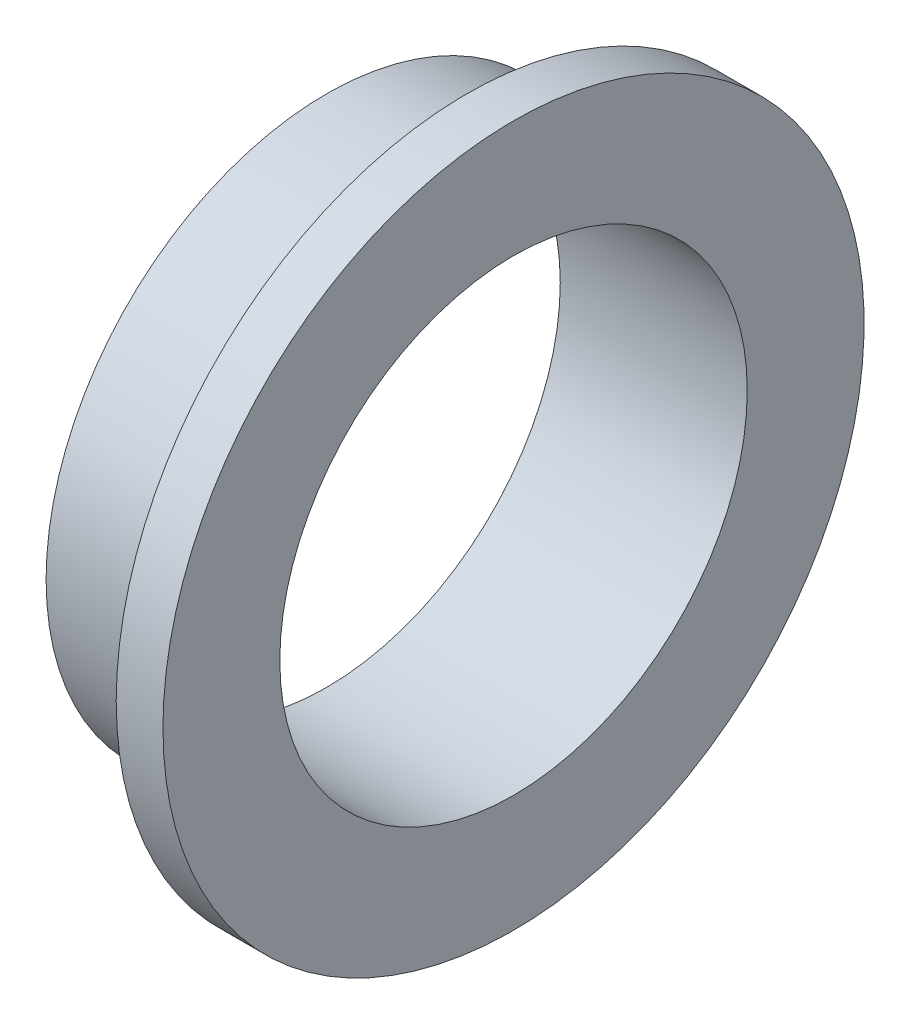
ISO-10303-21;
HEADER;
FILE_DESCRIPTION(('STEP AP214'),'2;1');
FILE_NAME('part.step','',(''),(''),'','','');
FILE_SCHEMA(('AUTOMOTIVE_DESIGN { 1 0 10303 214 1 1 1 1 }'));
ENDSEC;
DATA;
#1=APPLICATION_CONTEXT('core data for automotive mechanical design processes');
#2=APPLICATION_PROTOCOL_DEFINITION('international standard','automotive_design',2000,#1);
#3=PRODUCT_CONTEXT('',#1,'mechanical');
#4=PRODUCT('Part','Part','',(#3));
#5=PRODUCT_RELATED_PRODUCT_CATEGORY('part','',(#4));
#6=PRODUCT_DEFINITION_FORMATION('','',#4);
#7=PRODUCT_DEFINITION_CONTEXT('part definition',#1,'design');
#8=PRODUCT_DEFINITION('design','',#6,#7);
#9=PRODUCT_DEFINITION_SHAPE('','',#8);
#10=(LENGTH_UNIT() NAMED_UNIT(*) SI_UNIT(.MILLI.,.METRE.));
#11=(NAMED_UNIT(*) PLANE_ANGLE_UNIT() SI_UNIT($,.RADIAN.));
#12=(NAMED_UNIT(*) SI_UNIT($,.STERADIAN.) SOLID_ANGLE_UNIT());
#13=UNCERTAINTY_MEASURE_WITH_UNIT(LENGTH_MEASURE(1.E-05),#10,'distance_accuracy_value','');
#14=(GEOMETRIC_REPRESENTATION_CONTEXT(3) GLOBAL_UNCERTAINTY_ASSIGNED_CONTEXT((#13)) GLOBAL_UNIT_ASSIGNED_CONTEXT((#10,
#11,#12)) REPRESENTATION_CONTEXT('',''));
#15=CARTESIAN_POINT('',(0.,0.,0.));
#16=DIRECTION('',(0.,0.,1.));
#17=DIRECTION('',(1.,0.,0.));
#18=AXIS2_PLACEMENT_3D('',#15,#16,#17);
#19=CARTESIAN_POINT('',(0.,6.,0.));
#20=DIRECTION('',(1.,0.,0.));
#21=DIRECTION('',(0.,0.,-1.));
#22=AXIS2_PLACEMENT_3D('',#19,#20,#21);
#23=PLANE('',#22);
#24=CARTESIAN_POINT('',(0.,0.,0.));
#25=DIRECTION('',(-1.,0.,0.));
#26=DIRECTION('',(0.,0.,1.));
#27=AXIS2_PLACEMENT_3D('',#24,#25,#26);
#28=CIRCLE('',#27,5.);
#29=CARTESIAN_POINT('',(0.,0.,5.));
#30=VERTEX_POINT('',#29);
#31=EDGE_CURVE('E10',#30,#30,#28,.T.);
#32=ORIENTED_EDGE('',*,*,#31,.F.);
#33=EDGE_LOOP('',(#32));
#34=FACE_BOUND('',#33,.T.);
#35=CARTESIAN_POINT('',(0.,0.,0.));
#36=DIRECTION('',(-1.,0.,0.));
#37=DIRECTION('',(0.,0.,1.));
#38=AXIS2_PLACEMENT_3D('',#35,#36,#37);
#39=CIRCLE('',#38,6.);
#40=CARTESIAN_POINT('',(0.,0.,6.));
#41=VERTEX_POINT('',#40);
#42=EDGE_CURVE('E72',#41,#41,#39,.T.);
#43=ORIENTED_EDGE('',*,*,#42,.T.);
#44=EDGE_LOOP('',(#43));
#45=FACE_BOUND('',#44,.T.);
#46=ADVANCED_FACE('F45',(#34,#45),#23,.F.);
#47=CARTESIAN_POINT('',(0.,0.,0.));
#48=DIRECTION('',(-1.,0.,0.));
#49=DIRECTION('',(0.,0.,1.));
#50=AXIS2_PLACEMENT_3D('',#47,#48,#49);
#51=CYLINDRICAL_SURFACE('',#50,5.);
#52=CARTESIAN_POINT('',(4.,0.,0.));
#53=DIRECTION('',(-1.,0.,0.));
#54=DIRECTION('',(0.,0.,1.));
#55=AXIS2_PLACEMENT_3D('',#52,#53,#54);
#56=CIRCLE('',#55,5.);
#57=CARTESIAN_POINT('',(4.,0.,5.));
#58=VERTEX_POINT('',#57);
#59=EDGE_CURVE('E52',#58,#58,#56,.T.);
#60=ORIENTED_EDGE('',*,*,#59,.F.);
#61=EDGE_LOOP('',(#60));
#62=FACE_BOUND('',#61,.T.);
#63=ORIENTED_EDGE('',*,*,#31,.T.);
#64=EDGE_LOOP('',(#63));
#65=FACE_BOUND('',#64,.T.);
#66=ADVANCED_FACE('F98',(#62,#65),#51,.F.);
#67=CARTESIAN_POINT('',(4.,5.,0.));
#68=DIRECTION('',(-1.,0.,0.));
#69=DIRECTION('',(0.,0.,1.));
#70=AXIS2_PLACEMENT_3D('',#67,#68,#69);
#71=PLANE('',#70);
#72=CARTESIAN_POINT('',(4.,0.,0.));
#73=DIRECTION('',(-1.,0.,0.));
#74=DIRECTION('',(0.,0.,1.));
#75=AXIS2_PLACEMENT_3D('',#72,#73,#74);
#76=CIRCLE('',#75,7.5);
#77=CARTESIAN_POINT('',(4.,0.,7.5));
#78=VERTEX_POINT('',#77);
#79=EDGE_CURVE('E57',#78,#78,#76,.T.);
#80=ORIENTED_EDGE('',*,*,#79,.F.);
#81=EDGE_LOOP('',(#80));
#82=FACE_BOUND('',#81,.T.);
#83=ORIENTED_EDGE('',*,*,#59,.T.);
#84=EDGE_LOOP('',(#83));
#85=FACE_BOUND('',#84,.T.);
#86=ADVANCED_FACE('F93',(#82,#85),#71,.F.);
#87=CARTESIAN_POINT('',(0.,0.,0.));
#88=DIRECTION('',(-1.,0.,0.));
#89=DIRECTION('',(0.,0.,1.));
#90=AXIS2_PLACEMENT_3D('',#87,#88,#89);
#91=CYLINDRICAL_SURFACE('',#90,7.5);
#92=CARTESIAN_POINT('',(3.,0.,0.));
#93=DIRECTION('',(-1.,0.,0.));
#94=DIRECTION('',(0.,0.,1.));
#95=AXIS2_PLACEMENT_3D('',#92,#93,#94);
#96=CIRCLE('',#95,7.5);
#97=CARTESIAN_POINT('',(3.,0.,7.5));
#98=VERTEX_POINT('',#97);
#99=EDGE_CURVE('E62',#98,#98,#96,.T.);
#100=ORIENTED_EDGE('',*,*,#99,.F.);
#101=EDGE_LOOP('',(#100));
#102=FACE_BOUND('',#101,.T.);
#103=ORIENTED_EDGE('',*,*,#79,.T.);
#104=EDGE_LOOP('',(#103));
#105=FACE_BOUND('',#104,.T.);
#106=ADVANCED_FACE('F87',(#102,#105),#91,.T.);
#107=CARTESIAN_POINT('',(3.,7.5,0.));
#108=DIRECTION('',(1.,0.,0.));
#109=DIRECTION('',(0.,0.,-1.));
#110=AXIS2_PLACEMENT_3D('',#107,#108,#109);
#111=PLANE('',#110);
#112=CARTESIAN_POINT('',(3.,0.,0.));
#113=DIRECTION('',(-1.,0.,0.));
#114=DIRECTION('',(0.,0.,1.));
#115=AXIS2_PLACEMENT_3D('',#112,#113,#114);
#116=CIRCLE('',#115,6.);
#117=CARTESIAN_POINT('',(3.,0.,6.));
#118=VERTEX_POINT('',#117);
#119=EDGE_CURVE('E68',#118,#118,#116,.T.);
#120=ORIENTED_EDGE('',*,*,#119,.F.);
#121=EDGE_LOOP('',(#120));
#122=FACE_BOUND('',#121,.T.);
#123=ORIENTED_EDGE('',*,*,#99,.T.);
#124=EDGE_LOOP('',(#123));
#125=FACE_BOUND('',#124,.T.);
#126=ADVANCED_FACE('F81',(#122,#125),#111,.F.);
#127=CARTESIAN_POINT('',(0.,0.,0.));
#128=DIRECTION('',(-1.,0.,0.));
#129=DIRECTION('',(0.,0.,1.));
#130=AXIS2_PLACEMENT_3D('',#127,#128,#129);
#131=CYLINDRICAL_SURFACE('',#130,6.);
#132=ORIENTED_EDGE('',*,*,#42,.F.);
#133=EDGE_LOOP('',(#132));
#134=FACE_BOUND('',#133,.T.);
#135=ORIENTED_EDGE('',*,*,#119,.T.);
#136=EDGE_LOOP('',(#135));
#137=FACE_BOUND('',#136,.T.);
#138=ADVANCED_FACE('F78',(#134,#137),#131,.T.);
#139=CLOSED_SHELL('',(#46,#66,#86,#106,#126,#138));
#140=MANIFOLD_SOLID_BREP('B2',#139);
#141=ADVANCED_BREP_SHAPE_REPRESENTATION('',(#18,#140),#14);
#142=SHAPE_DEFINITION_REPRESENTATION(#9,#141);
ENDSEC;
END-ISO-10303-21;
